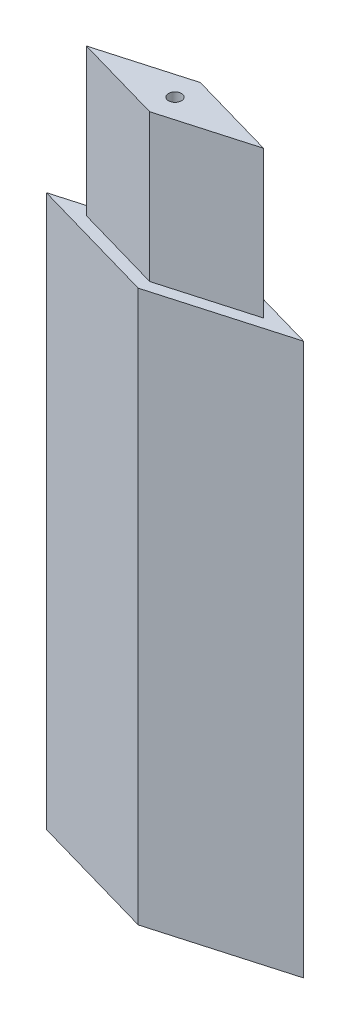
ISO-10303-21;
HEADER;
FILE_DESCRIPTION(('STEP AP214'),'2;1');
FILE_NAME('part.step','',(''),(''),'','','');
FILE_SCHEMA(('AUTOMOTIVE_DESIGN { 1 0 10303 214 1 1 1 1 }'));
ENDSEC;
DATA;
#1=APPLICATION_CONTEXT('core data for automotive mechanical design processes');
#2=APPLICATION_PROTOCOL_DEFINITION('international standard','automotive_design',2000,#1);
#3=PRODUCT_CONTEXT('',#1,'mechanical');
#4=PRODUCT('Part','Part','',(#3));
#5=PRODUCT_RELATED_PRODUCT_CATEGORY('part','',(#4));
#6=PRODUCT_DEFINITION_FORMATION('','',#4);
#7=PRODUCT_DEFINITION_CONTEXT('part definition',#1,'design');
#8=PRODUCT_DEFINITION('design','',#6,#7);
#9=PRODUCT_DEFINITION_SHAPE('','',#8);
#10=(LENGTH_UNIT() NAMED_UNIT(*) SI_UNIT(.MILLI.,.METRE.));
#11=(NAMED_UNIT(*) PLANE_ANGLE_UNIT() SI_UNIT($,.RADIAN.));
#12=(NAMED_UNIT(*) SI_UNIT($,.STERADIAN.) SOLID_ANGLE_UNIT());
#13=UNCERTAINTY_MEASURE_WITH_UNIT(LENGTH_MEASURE(1.E-05),#10,'distance_accuracy_value','');
#14=(GEOMETRIC_REPRESENTATION_CONTEXT(3) GLOBAL_UNCERTAINTY_ASSIGNED_CONTEXT((#13)) GLOBAL_UNIT_ASSIGNED_CONTEXT((#10,
#11,#12)) REPRESENTATION_CONTEXT('',''));
#15=CARTESIAN_POINT('',(0.,0.,0.));
#16=DIRECTION('',(0.,0.,1.));
#17=DIRECTION('',(1.,0.,0.));
#18=AXIS2_PLACEMENT_3D('',#15,#16,#17);
#19=CARTESIAN_POINT('',(-35.,582.,-10.000025));
#20=DIRECTION('',(0.,1.,0.));
#21=DIRECTION('',(0.,0.,1.));
#22=AXIS2_PLACEMENT_3D('',#19,#20,#21);
#23=PLANE('',#22);
#24=CARTESIAN_POINT('',(0.,582.,0.));
#25=DIRECTION('',(0.,1.,0.));
#26=DIRECTION('',(0.,0.,1.));
#27=AXIS2_PLACEMENT_3D('',#24,#25,#26);
#28=CIRCLE('',#27,1.75);
#29=CARTESIAN_POINT('',(0.,582.,1.75));
#30=VERTEX_POINT('',#29);
#31=EDGE_CURVE('E237',#30,#30,#28,.F.);
#32=ORIENTED_EDGE('',*,*,#31,.T.);
#33=EDGE_LOOP('',(#32));
#34=FACE_BOUND('',#33,.T.);
#35=DIRECTION('',(0.961523947640823,0.,-0.274721127897378));
#36=VECTOR('',#35,1.);
#37=CARTESIAN_POINT('',(0.,582.,6.87995290459406));
#38=LINE('',#37,#36);
#39=CARTESIAN_POINT('',(0.,582.,6.87995290459406));
#40=VERTEX_POINT('',#39);
#41=CARTESIAN_POINT('',(24.0798351660792,582.,0.));
#42=VERTEX_POINT('',#41);
#43=EDGE_CURVE('E170',#40,#42,#38,.T.);
#44=ORIENTED_EDGE('',*,*,#43,.T.);
#45=DIRECTION('',(-0.961523947640823,0.,-0.274721127897378));
#46=VECTOR('',#45,1.);
#47=CARTESIAN_POINT('',(24.0798351660792,582.,0.));
#48=LINE('',#47,#46);
#49=CARTESIAN_POINT('',(0.,582.,-6.87995290459406));
#50=VERTEX_POINT('',#49);
#51=EDGE_CURVE('E177',#42,#50,#48,.T.);
#52=ORIENTED_EDGE('',*,*,#51,.T.);
#53=DIRECTION('',(-0.961523947640823,0.,0.274721127897378));
#54=VECTOR('',#53,1.);
#55=CARTESIAN_POINT('',(0.,582.,-6.87995290459406));
#56=LINE('',#55,#54);
#57=CARTESIAN_POINT('',(-24.0798351660792,582.,0.));
#58=VERTEX_POINT('',#57);
#59=EDGE_CURVE('E151',#50,#58,#56,.T.);
#60=ORIENTED_EDGE('',*,*,#59,.T.);
#61=DIRECTION('',(0.961523947640823,0.,0.274721127897378));
#62=VECTOR('',#61,1.);
#63=CARTESIAN_POINT('',(-24.0798351660792,582.,0.));
#64=LINE('',#63,#62);
#65=EDGE_CURVE('E72',#58,#40,#64,.T.);
#66=ORIENTED_EDGE('',*,*,#65,.T.);
#67=EDGE_LOOP('',(#44,#52,#60,#66));
#68=FACE_BOUND('',#67,.T.);
#69=ADVANCED_FACE('F57',(#34,#68),#23,.T.);
#70=CARTESIAN_POINT('',(35.,0.,0.));
#71=DIRECTION('',(0.274721127897378,0.,-0.961523947640823));
#72=DIRECTION('',(-0.961523947640823,0.,-0.274721127897378));
#73=AXIS2_PLACEMENT_3D('',#70,#71,#72);
#74=PLANE('',#73);
#75=DIRECTION('',(0.,1.,0.));
#76=VECTOR('',#75,1.);
#77=CARTESIAN_POINT('',(0.,0.,-10.));
#78=LINE('',#77,#76);
#79=CARTESIAN_POINT('',(0.,392.,-10.));
#80=VERTEX_POINT('',#79);
#81=CARTESIAN_POINT('',(0.,542.,-10.));
#82=VERTEX_POINT('',#81);
#83=EDGE_CURVE('E242',#80,#82,#78,.T.);
#84=ORIENTED_EDGE('',*,*,#83,.T.);
#85=DIRECTION('',(0.961523947640823,0.,0.274721127897378));
#86=VECTOR('',#85,1.);
#87=CARTESIAN_POINT('',(35.,542.,0.));
#88=LINE('',#87,#86);
#89=CARTESIAN_POINT('',(35.,542.,0.));
#90=VERTEX_POINT('',#89);
#91=EDGE_CURVE('E189',#82,#90,#88,.T.);
#92=ORIENTED_EDGE('',*,*,#91,.T.);
#93=DIRECTION('',(0.,1.,0.));
#94=VECTOR('',#93,1.);
#95=CARTESIAN_POINT('',(35.,0.,0.));
#96=LINE('',#95,#94);
#97=CARTESIAN_POINT('',(35.,392.,0.));
#98=VERTEX_POINT('',#97);
#99=EDGE_CURVE('E241',#98,#90,#96,.T.);
#100=ORIENTED_EDGE('',*,*,#99,.F.);
#101=DIRECTION('',(-0.961523947640823,0.,-0.274721127897378));
#102=VECTOR('',#101,1.);
#103=CARTESIAN_POINT('',(35.,392.,0.));
#104=LINE('',#103,#102);
#105=EDGE_CURVE('E234',#98,#80,#104,.T.);
#106=ORIENTED_EDGE('',*,*,#105,.T.);
#107=EDGE_LOOP('',(#84,#92,#100,#106));
#108=FACE_BOUND('',#107,.T.);
#109=ADVANCED_FACE('F276',(#108),#74,.T.);
#110=CARTESIAN_POINT('',(0.,0.,-10.));
#111=DIRECTION('',(-0.274721127897378,0.,-0.961523947640823));
#112=DIRECTION('',(-0.961523947640823,0.,0.274721127897378));
#113=AXIS2_PLACEMENT_3D('',#110,#111,#112);
#114=PLANE('',#113);
#115=DIRECTION('',(0.,1.,0.));
#116=VECTOR('',#115,1.);
#117=CARTESIAN_POINT('',(-35.,0.,0.));
#118=LINE('',#117,#116);
#119=CARTESIAN_POINT('',(-35.,392.,0.));
#120=VERTEX_POINT('',#119);
#121=CARTESIAN_POINT('',(-35.,542.,0.));
#122=VERTEX_POINT('',#121);
#123=EDGE_CURVE('E65',#120,#122,#118,.T.);
#124=ORIENTED_EDGE('',*,*,#123,.T.);
#125=DIRECTION('',(0.961523947640823,0.,-0.274721127897378));
#126=VECTOR('',#125,1.);
#127=CARTESIAN_POINT('',(0.,542.,-10.));
#128=LINE('',#127,#126);
#129=EDGE_CURVE('E186',#122,#82,#128,.T.);
#130=ORIENTED_EDGE('',*,*,#129,.T.);
#131=ORIENTED_EDGE('',*,*,#83,.F.);
#132=DIRECTION('',(-0.961523947640823,0.,0.274721127897378));
#133=VECTOR('',#132,1.);
#134=CARTESIAN_POINT('',(0.,392.,-10.));
#135=LINE('',#134,#133);
#136=EDGE_CURVE('E231',#80,#120,#135,.T.);
#137=ORIENTED_EDGE('',*,*,#136,.T.);
#138=EDGE_LOOP('',(#124,#130,#131,#137));
#139=FACE_BOUND('',#138,.T.);
#140=ADVANCED_FACE('F59',(#139),#114,.T.);
#141=CARTESIAN_POINT('',(0.,0.,10.));
#142=DIRECTION('',(-0.274721127897378,0.,0.961523947640823));
#143=DIRECTION('',(0.961523947640823,0.,0.274721127897378));
#144=AXIS2_PLACEMENT_3D('',#141,#142,#143);
#145=PLANE('',#144);
#146=DIRECTION('',(0.,1.,0.));
#147=VECTOR('',#146,1.);
#148=CARTESIAN_POINT('',(0.,0.,10.));
#149=LINE('',#148,#147);
#150=CARTESIAN_POINT('',(0.,392.,10.));
#151=VERTEX_POINT('',#150);
#152=CARTESIAN_POINT('',(0.,542.,10.));
#153=VERTEX_POINT('',#152);
#154=EDGE_CURVE('E238',#151,#153,#149,.T.);
#155=ORIENTED_EDGE('',*,*,#154,.T.);
#156=DIRECTION('',(-0.961523947640823,0.,-0.274721127897378));
#157=VECTOR('',#156,1.);
#158=CARTESIAN_POINT('',(0.,542.,10.));
#159=LINE('',#158,#157);
#160=EDGE_CURVE('E80',#153,#122,#159,.T.);
#161=ORIENTED_EDGE('',*,*,#160,.T.);
#162=ORIENTED_EDGE('',*,*,#123,.F.);
#163=DIRECTION('',(0.961523947640823,0.,0.274721127897378));
#164=VECTOR('',#163,1.);
#165=CARTESIAN_POINT('',(0.,392.,10.));
#166=LINE('',#165,#164);
#167=EDGE_CURVE('E228',#120,#151,#166,.T.);
#168=ORIENTED_EDGE('',*,*,#167,.T.);
#169=EDGE_LOOP('',(#155,#161,#162,#168));
#170=FACE_BOUND('',#169,.T.);
#171=ADVANCED_FACE('F270',(#170),#145,.T.);
#172=CARTESIAN_POINT('',(35.,0.,0.));
#173=DIRECTION('',(0.274721127897378,0.,0.961523947640823));
#174=DIRECTION('',(0.961523947640823,0.,-0.274721127897378));
#175=AXIS2_PLACEMENT_3D('',#172,#173,#174);
#176=PLANE('',#175);
#177=ORIENTED_EDGE('',*,*,#99,.T.);
#178=DIRECTION('',(-0.961523947640823,0.,0.274721127897378));
#179=VECTOR('',#178,1.);
#180=CARTESIAN_POINT('',(35.,542.,0.));
#181=LINE('',#180,#179);
#182=EDGE_CURVE('E13',#90,#153,#181,.T.);
#183=ORIENTED_EDGE('',*,*,#182,.T.);
#184=ORIENTED_EDGE('',*,*,#154,.F.);
#185=DIRECTION('',(0.961523947640823,0.,-0.274721127897378));
#186=VECTOR('',#185,1.);
#187=CARTESIAN_POINT('',(35.,392.,0.));
#188=LINE('',#187,#186);
#189=EDGE_CURVE('E225',#151,#98,#188,.T.);
#190=ORIENTED_EDGE('',*,*,#189,.T.);
#191=EDGE_LOOP('',(#177,#183,#184,#190));
#192=FACE_BOUND('',#191,.T.);
#193=ADVANCED_FACE('F261',(#192),#176,.T.);
#194=CARTESIAN_POINT('',(0.,612.,0.));
#195=DIRECTION('',(0.,-1.,0.));
#196=DIRECTION('',(0.,0.,-1.));
#197=AXIS2_PLACEMENT_3D('',#194,#195,#196);
#198=CYLINDRICAL_SURFACE('',#197,1.75);
#199=ORIENTED_EDGE('',*,*,#31,.F.);
#200=EDGE_LOOP('',(#199));
#201=FACE_BOUND('',#200,.T.);
#202=CARTESIAN_POINT('',(0.,433.,0.));
#203=DIRECTION('',(0.,-1.,0.));
#204=DIRECTION('',(0.,0.,-1.));
#205=AXIS2_PLACEMENT_3D('',#202,#203,#204);
#206=CIRCLE('',#205,1.75);
#207=CARTESIAN_POINT('',(0.,433.,-1.75));
#208=VERTEX_POINT('',#207);
#209=EDGE_CURVE('E218',#208,#208,#206,.F.);
#210=ORIENTED_EDGE('',*,*,#209,.F.);
#211=EDGE_LOOP('',(#210));
#212=FACE_BOUND('',#211,.T.);
#213=ADVANCED_FACE('F258',(#201,#212),#198,.F.);
#214=CARTESIAN_POINT('',(-35.,392.,-10.000025));
#215=DIRECTION('',(0.,-1.,0.));
#216=DIRECTION('',(0.,0.,-1.));
#217=AXIS2_PLACEMENT_3D('',#214,#215,#216);
#218=PLANE('',#217);
#219=DIRECTION('',(0.961523947640823,0.,0.274721127897378));
#220=VECTOR('',#219,1.);
#221=CARTESIAN_POINT('',(0.,392.,-7.08795604428779));
#222=LINE('',#221,#220);
#223=CARTESIAN_POINT('',(0.,392.,-7.08795604428779));
#224=VERTEX_POINT('',#223);
#225=CARTESIAN_POINT('',(24.8078461550073,392.,0.));
#226=VERTEX_POINT('',#225);
#227=EDGE_CURVE('E192',#224,#226,#222,.T.);
#228=ORIENTED_EDGE('',*,*,#227,.F.);
#229=DIRECTION('',(0.961523947640823,0.,-0.274721127897378));
#230=VECTOR('',#229,1.);
#231=CARTESIAN_POINT('',(-24.8078461550073,392.,0.));
#232=LINE('',#231,#230);
#233=CARTESIAN_POINT('',(-24.8078461550073,392.,0.));
#234=VERTEX_POINT('',#233);
#235=EDGE_CURVE('E197',#234,#224,#232,.T.);
#236=ORIENTED_EDGE('',*,*,#235,.F.);
#237=DIRECTION('',(-0.961523947640823,0.,-0.274721127897378));
#238=VECTOR('',#237,1.);
#239=CARTESIAN_POINT('',(0.,392.,7.08795604428779));
#240=LINE('',#239,#238);
#241=CARTESIAN_POINT('',(0.,392.,7.08795604428779));
#242=VERTEX_POINT('',#241);
#243=EDGE_CURVE('E211',#242,#234,#240,.T.);
#244=ORIENTED_EDGE('',*,*,#243,.F.);
#245=DIRECTION('',(-0.961523947640823,0.,0.274721127897378));
#246=VECTOR('',#245,1.);
#247=CARTESIAN_POINT('',(24.8078461550073,392.,0.));
#248=LINE('',#247,#246);
#249=EDGE_CURVE('E208',#226,#242,#248,.T.);
#250=ORIENTED_EDGE('',*,*,#249,.F.);
#251=EDGE_LOOP('',(#228,#236,#244,#250));
#252=FACE_BOUND('',#251,.T.);
#253=ORIENTED_EDGE('',*,*,#189,.F.);
#254=ORIENTED_EDGE('',*,*,#167,.F.);
#255=ORIENTED_EDGE('',*,*,#136,.F.);
#256=ORIENTED_EDGE('',*,*,#105,.F.);
#257=EDGE_LOOP('',(#253,#254,#255,#256));
#258=FACE_BOUND('',#257,.T.);
#259=ADVANCED_FACE('F260',(#252,#258),#218,.T.);
#260=CARTESIAN_POINT('',(0.,433.,0.));
#261=DIRECTION('',(0.,-1.,0.));
#262=DIRECTION('',(0.,0.,-1.));
#263=AXIS2_PLACEMENT_3D('',#260,#261,#262);
#264=PLANE('',#263);
#265=DIRECTION('',(0.961523947640823,0.,0.274721127897378));
#266=VECTOR('',#265,1.);
#267=CARTESIAN_POINT('',(0.,433.,-7.08795604428779));
#268=LINE('',#267,#266);
#269=CARTESIAN_POINT('',(0.,433.,-7.08795604428779));
#270=VERTEX_POINT('',#269);
#271=CARTESIAN_POINT('',(24.8078461550073,433.,0.));
#272=VERTEX_POINT('',#271);
#273=EDGE_CURVE('E193',#270,#272,#268,.T.);
#274=ORIENTED_EDGE('',*,*,#273,.T.);
#275=DIRECTION('',(-0.961523947640823,0.,0.274721127897378));
#276=VECTOR('',#275,1.);
#277=CARTESIAN_POINT('',(24.8078461550073,433.,0.));
#278=LINE('',#277,#276);
#279=CARTESIAN_POINT('',(0.,433.,7.08795604428779));
#280=VERTEX_POINT('',#279);
#281=EDGE_CURVE('E196',#272,#280,#278,.T.);
#282=ORIENTED_EDGE('',*,*,#281,.T.);
#283=DIRECTION('',(-0.961523947640823,0.,-0.274721127897378));
#284=VECTOR('',#283,1.);
#285=CARTESIAN_POINT('',(0.,433.,7.08795604428779));
#286=LINE('',#285,#284);
#287=CARTESIAN_POINT('',(-24.8078461550073,433.,0.));
#288=VERTEX_POINT('',#287);
#289=EDGE_CURVE('E200',#280,#288,#286,.T.);
#290=ORIENTED_EDGE('',*,*,#289,.T.);
#291=DIRECTION('',(0.961523947640823,0.,-0.274721127897378));
#292=VECTOR('',#291,1.);
#293=CARTESIAN_POINT('',(-24.8078461550073,433.,0.));
#294=LINE('',#293,#292);
#295=EDGE_CURVE('E203',#288,#270,#294,.T.);
#296=ORIENTED_EDGE('',*,*,#295,.T.);
#297=EDGE_LOOP('',(#274,#282,#290,#296));
#298=FACE_BOUND('',#297,.T.);
#299=ORIENTED_EDGE('',*,*,#209,.T.);
#300=EDGE_LOOP('',(#299));
#301=FACE_BOUND('',#300,.T.);
#302=ADVANCED_FACE('F256',(#298,#301),#264,.T.);
#303=CARTESIAN_POINT('',(0.,433.,-7.08795604428779));
#304=DIRECTION('',(0.274721127897378,0.,-0.961523947640823));
#305=DIRECTION('',(-0.961523947640823,0.,-0.274721127897378));
#306=AXIS2_PLACEMENT_3D('',#303,#304,#305);
#307=PLANE('',#306);
#308=ORIENTED_EDGE('',*,*,#227,.T.);
#309=DIRECTION('',(0.,-1.,0.));
#310=VECTOR('',#309,1.);
#311=CARTESIAN_POINT('',(24.8078461550073,433.,0.));
#312=LINE('',#311,#310);
#313=EDGE_CURVE('E206',#272,#226,#312,.T.);
#314=ORIENTED_EDGE('',*,*,#313,.F.);
#315=ORIENTED_EDGE('',*,*,#273,.F.);
#316=DIRECTION('',(0.,-1.,0.));
#317=VECTOR('',#316,1.);
#318=CARTESIAN_POINT('',(0.,433.,-7.08795604428779));
#319=LINE('',#318,#317);
#320=EDGE_CURVE('E216',#270,#224,#319,.T.);
#321=ORIENTED_EDGE('',*,*,#320,.T.);
#322=EDGE_LOOP('',(#308,#314,#315,#321));
#323=FACE_BOUND('',#322,.T.);
#324=ADVANCED_FACE('F286',(#323),#307,.F.);
#325=CARTESIAN_POINT('',(-24.8078461550073,433.,0.));
#326=DIRECTION('',(-0.274721127897378,0.,-0.961523947640823));
#327=DIRECTION('',(-0.961523947640823,0.,0.274721127897378));
#328=AXIS2_PLACEMENT_3D('',#325,#326,#327);
#329=PLANE('',#328);
#330=ORIENTED_EDGE('',*,*,#235,.T.);
#331=ORIENTED_EDGE('',*,*,#320,.F.);
#332=ORIENTED_EDGE('',*,*,#295,.F.);
#333=DIRECTION('',(0.,-1.,0.));
#334=VECTOR('',#333,1.);
#335=CARTESIAN_POINT('',(-24.8078461550073,433.,0.));
#336=LINE('',#335,#334);
#337=EDGE_CURVE('E219',#288,#234,#336,.T.);
#338=ORIENTED_EDGE('',*,*,#337,.T.);
#339=EDGE_LOOP('',(#330,#331,#332,#338));
#340=FACE_BOUND('',#339,.T.);
#341=ADVANCED_FACE('F289',(#340),#329,.F.);
#342=CARTESIAN_POINT('',(0.,433.,7.08795604428779));
#343=DIRECTION('',(-0.274721127897378,0.,0.961523947640823));
#344=DIRECTION('',(0.961523947640823,0.,0.274721127897378));
#345=AXIS2_PLACEMENT_3D('',#342,#343,#344);
#346=PLANE('',#345);
#347=ORIENTED_EDGE('',*,*,#243,.T.);
#348=ORIENTED_EDGE('',*,*,#337,.F.);
#349=ORIENTED_EDGE('',*,*,#289,.F.);
#350=DIRECTION('',(0.,-1.,0.));
#351=VECTOR('',#350,1.);
#352=CARTESIAN_POINT('',(0.,433.,7.08795604428779));
#353=LINE('',#352,#351);
#354=EDGE_CURVE('E221',#280,#242,#353,.T.);
#355=ORIENTED_EDGE('',*,*,#354,.T.);
#356=EDGE_LOOP('',(#347,#348,#349,#355));
#357=FACE_BOUND('',#356,.T.);
#358=ADVANCED_FACE('F294',(#357),#346,.F.);
#359=CARTESIAN_POINT('',(24.8078461550073,433.,0.));
#360=DIRECTION('',(0.274721127897378,0.,0.961523947640823));
#361=DIRECTION('',(0.961523947640823,0.,-0.274721127897378));
#362=AXIS2_PLACEMENT_3D('',#359,#360,#361);
#363=PLANE('',#362);
#364=ORIENTED_EDGE('',*,*,#249,.T.);
#365=ORIENTED_EDGE('',*,*,#354,.F.);
#366=ORIENTED_EDGE('',*,*,#281,.F.);
#367=ORIENTED_EDGE('',*,*,#313,.T.);
#368=EDGE_LOOP('',(#364,#365,#366,#367));
#369=FACE_BOUND('',#368,.T.);
#370=ADVANCED_FACE('F291',(#369),#363,.F.);
#371=CARTESIAN_POINT('',(0.,542.,0.));
#372=DIRECTION('',(0.,1.,0.));
#373=DIRECTION('',(0.,0.,1.));
#374=AXIS2_PLACEMENT_3D('',#371,#372,#373);
#375=PLANE('',#374);
#376=ORIENTED_EDGE('',*,*,#129,.F.);
#377=ORIENTED_EDGE('',*,*,#160,.F.);
#378=ORIENTED_EDGE('',*,*,#182,.F.);
#379=ORIENTED_EDGE('',*,*,#91,.F.);
#380=EDGE_LOOP('',(#376,#377,#378,#379));
#381=FACE_BOUND('',#380,.T.);
#382=DIRECTION('',(0.961523947640823,0.,-0.274721127897378));
#383=VECTOR('',#382,1.);
#384=CARTESIAN_POINT('',(0.,542.,6.87995290459406));
#385=LINE('',#384,#383);
#386=CARTESIAN_POINT('',(0.,542.,6.87995290459406));
#387=VERTEX_POINT('',#386);
#388=CARTESIAN_POINT('',(24.0798351660792,542.,0.));
#389=VERTEX_POINT('',#388);
#390=EDGE_CURVE('E157',#387,#389,#385,.T.);
#391=ORIENTED_EDGE('',*,*,#390,.F.);
#392=DIRECTION('',(0.961523947640823,0.,0.274721127897378));
#393=VECTOR('',#392,1.);
#394=CARTESIAN_POINT('',(-24.0798351660792,542.,0.));
#395=LINE('',#394,#393);
#396=CARTESIAN_POINT('',(-24.0798351660792,542.,0.));
#397=VERTEX_POINT('',#396);
#398=EDGE_CURVE('E166',#397,#387,#395,.T.);
#399=ORIENTED_EDGE('',*,*,#398,.F.);
#400=DIRECTION('',(-0.961523947640823,0.,0.274721127897378));
#401=VECTOR('',#400,1.);
#402=CARTESIAN_POINT('',(0.,542.,-6.87995290459406));
#403=LINE('',#402,#401);
#404=CARTESIAN_POINT('',(0.,542.,-6.87995290459406));
#405=VERTEX_POINT('',#404);
#406=EDGE_CURVE('E149',#405,#397,#403,.T.);
#407=ORIENTED_EDGE('',*,*,#406,.F.);
#408=DIRECTION('',(-0.961523947640823,0.,-0.274721127897378));
#409=VECTOR('',#408,1.);
#410=CARTESIAN_POINT('',(24.0798351660792,542.,0.));
#411=LINE('',#410,#409);
#412=EDGE_CURVE('E163',#389,#405,#411,.T.);
#413=ORIENTED_EDGE('',*,*,#412,.F.);
#414=EDGE_LOOP('',(#391,#399,#407,#413));
#415=FACE_BOUND('',#414,.T.);
#416=ADVANCED_FACE('F162',(#381,#415),#375,.T.);
#417=CARTESIAN_POINT('',(24.0798351660792,542.,0.));
#418=DIRECTION('',(0.274721127897378,0.,-0.961523947640823));
#419=DIRECTION('',(-0.961523947640823,0.,-0.274721127897378));
#420=AXIS2_PLACEMENT_3D('',#417,#418,#419);
#421=PLANE('',#420);
#422=ORIENTED_EDGE('',*,*,#51,.F.);
#423=DIRECTION('',(0.,1.,0.));
#424=VECTOR('',#423,1.);
#425=CARTESIAN_POINT('',(24.0798351660792,542.,0.));
#426=LINE('',#425,#424);
#427=EDGE_CURVE('E169',#389,#42,#426,.T.);
#428=ORIENTED_EDGE('',*,*,#427,.F.);
#429=ORIENTED_EDGE('',*,*,#412,.T.);
#430=DIRECTION('',(0.,1.,0.));
#431=VECTOR('',#430,1.);
#432=CARTESIAN_POINT('',(0.,542.,-6.87995290459406));
#433=LINE('',#432,#431);
#434=EDGE_CURVE('E146',#405,#50,#433,.T.);
#435=ORIENTED_EDGE('',*,*,#434,.T.);
#436=EDGE_LOOP('',(#422,#428,#429,#435));
#437=FACE_BOUND('',#436,.T.);
#438=ADVANCED_FACE('F168',(#437),#421,.T.);
#439=CARTESIAN_POINT('',(0.,542.,6.87995290459406));
#440=DIRECTION('',(0.274721127897378,0.,0.961523947640823));
#441=DIRECTION('',(0.961523947640823,0.,-0.274721127897378));
#442=AXIS2_PLACEMENT_3D('',#439,#440,#441);
#443=PLANE('',#442);
#444=ORIENTED_EDGE('',*,*,#43,.F.);
#445=DIRECTION('',(0.,1.,0.));
#446=VECTOR('',#445,1.);
#447=CARTESIAN_POINT('',(0.,542.,6.87995290459406));
#448=LINE('',#447,#446);
#449=EDGE_CURVE('E182',#387,#40,#448,.T.);
#450=ORIENTED_EDGE('',*,*,#449,.F.);
#451=ORIENTED_EDGE('',*,*,#390,.T.);
#452=ORIENTED_EDGE('',*,*,#427,.T.);
#453=EDGE_LOOP('',(#444,#450,#451,#452));
#454=FACE_BOUND('',#453,.T.);
#455=ADVANCED_FACE('F309',(#454),#443,.T.);
#456=CARTESIAN_POINT('',(-24.0798351660792,542.,0.));
#457=DIRECTION('',(-0.274721127897378,0.,0.961523947640823));
#458=DIRECTION('',(0.961523947640823,0.,0.274721127897378));
#459=AXIS2_PLACEMENT_3D('',#456,#457,#458);
#460=PLANE('',#459);
#461=ORIENTED_EDGE('',*,*,#65,.F.);
#462=DIRECTION('',(0.,1.,0.));
#463=VECTOR('',#462,1.);
#464=CARTESIAN_POINT('',(-24.0798351660792,542.,0.));
#465=LINE('',#464,#463);
#466=EDGE_CURVE('E156',#397,#58,#465,.T.);
#467=ORIENTED_EDGE('',*,*,#466,.F.);
#468=ORIENTED_EDGE('',*,*,#398,.T.);
#469=ORIENTED_EDGE('',*,*,#449,.T.);
#470=EDGE_LOOP('',(#461,#467,#468,#469));
#471=FACE_BOUND('',#470,.T.);
#472=ADVANCED_FACE('F312',(#471),#460,.T.);
#473=CARTESIAN_POINT('',(0.,542.,-6.87995290459406));
#474=DIRECTION('',(-0.274721127897378,0.,-0.961523947640823));
#475=DIRECTION('',(-0.961523947640823,0.,0.274721127897378));
#476=AXIS2_PLACEMENT_3D('',#473,#474,#475);
#477=PLANE('',#476);
#478=ORIENTED_EDGE('',*,*,#59,.F.);
#479=ORIENTED_EDGE('',*,*,#434,.F.);
#480=ORIENTED_EDGE('',*,*,#406,.T.);
#481=ORIENTED_EDGE('',*,*,#466,.T.);
#482=EDGE_LOOP('',(#478,#479,#480,#481));
#483=FACE_BOUND('',#482,.T.);
#484=ADVANCED_FACE('F148',(#483),#477,.T.);
#485=CLOSED_SHELL('',(#69,#109,#140,#171,#193,#213,#259,#302,#324,#341,#358,#370,#416,#438,#455,
#472,#484));
#486=MANIFOLD_SOLID_BREP('B2',#485);
#487=ADVANCED_BREP_SHAPE_REPRESENTATION('',(#18,#486),#14);
#488=SHAPE_DEFINITION_REPRESENTATION(#9,#487);
ENDSEC;
END-ISO-10303-21;
